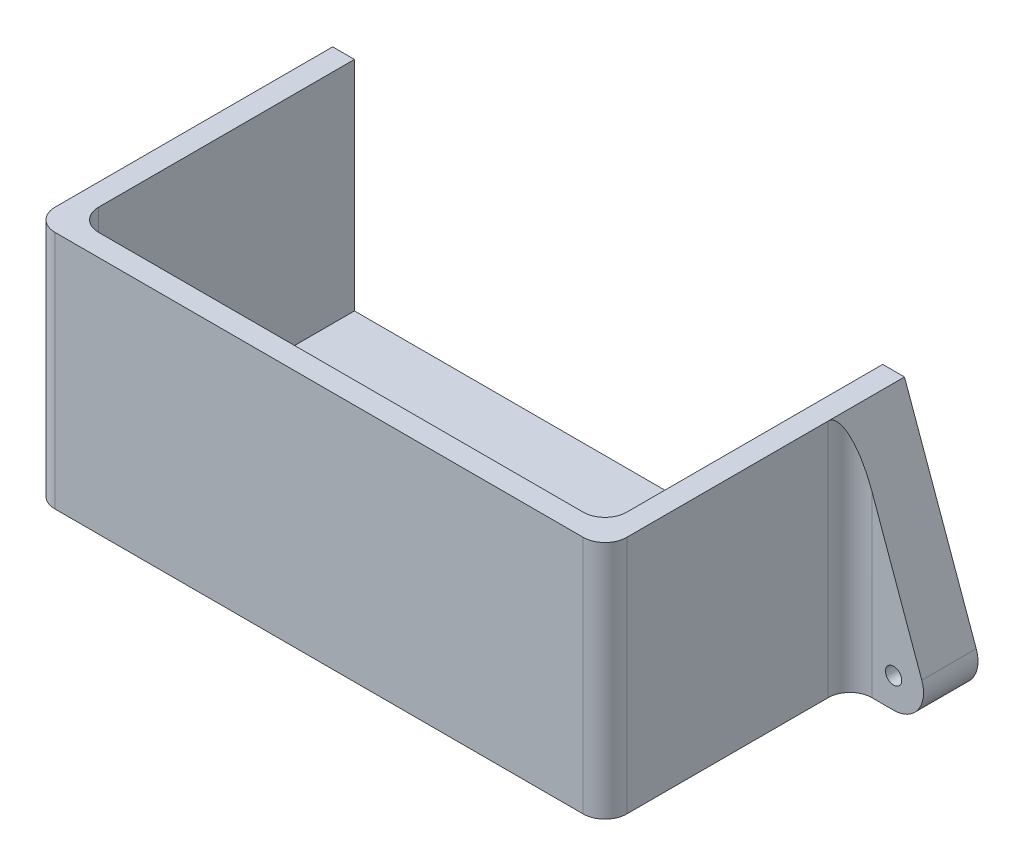
ISO-10303-21;
HEADER;
FILE_DESCRIPTION(('STEP AP214'),'2;1');
FILE_NAME('part.step','',(''),(''),'','','');
FILE_SCHEMA(('AUTOMOTIVE_DESIGN { 1 0 10303 214 1 1 1 1 }'));
ENDSEC;
DATA;
#1=APPLICATION_CONTEXT('core data for automotive mechanical design processes');
#2=APPLICATION_PROTOCOL_DEFINITION('international standard','automotive_design',2000,#1);
#3=PRODUCT_CONTEXT('',#1,'mechanical');
#4=PRODUCT('Part','Part','',(#3));
#5=PRODUCT_RELATED_PRODUCT_CATEGORY('part','',(#4));
#6=PRODUCT_DEFINITION_FORMATION('','',#4);
#7=PRODUCT_DEFINITION_CONTEXT('part definition',#1,'design');
#8=PRODUCT_DEFINITION('design','',#6,#7);
#9=PRODUCT_DEFINITION_SHAPE('','',#8);
#10=(LENGTH_UNIT() NAMED_UNIT(*) SI_UNIT(.MILLI.,.METRE.));
#11=(NAMED_UNIT(*) PLANE_ANGLE_UNIT() SI_UNIT($,.RADIAN.));
#12=(NAMED_UNIT(*) SI_UNIT($,.STERADIAN.) SOLID_ANGLE_UNIT());
#13=UNCERTAINTY_MEASURE_WITH_UNIT(LENGTH_MEASURE(1.E-05),#10,'distance_accuracy_value','');
#14=(GEOMETRIC_REPRESENTATION_CONTEXT(3) GLOBAL_UNCERTAINTY_ASSIGNED_CONTEXT((#13)) GLOBAL_UNIT_ASSIGNED_CONTEXT((#10,
#11,#12)) REPRESENTATION_CONTEXT('',''));
#15=CARTESIAN_POINT('',(0.,0.,0.));
#16=DIRECTION('',(0.,0.,1.));
#17=DIRECTION('',(1.,0.,0.));
#18=AXIS2_PLACEMENT_3D('',#15,#16,#17);
#19=CARTESIAN_POINT('',(-26.25,2.,-12.75));
#20=DIRECTION('',(1.,0.,0.));
#21=DIRECTION('',(0.,0.,-1.));
#22=AXIS2_PLACEMENT_3D('',#19,#20,#21);
#23=PLANE('',#22);
#24=DIRECTION('',(0.,0.,1.));
#25=VECTOR('',#24,1.);
#26=CARTESIAN_POINT('',(-26.25,22.,-12.75));
#27=LINE('',#26,#25);
#28=CARTESIAN_POINT('',(-26.25,22.,-5.75));
#29=VERTEX_POINT('',#28);
#30=CARTESIAN_POINT('',(-26.25,22.,12.75));
#31=VERTEX_POINT('',#30);
#32=EDGE_CURVE('E234',#29,#31,#27,.T.);
#33=ORIENTED_EDGE('',*,*,#32,.F.);
#34=DIRECTION('',(0.,1.,0.));
#35=VECTOR('',#34,1.);
#36=CARTESIAN_POINT('',(-26.25,0.,-5.75));
#37=LINE('',#36,#35);
#38=CARTESIAN_POINT('',(-26.25,0.,-5.75));
#39=VERTEX_POINT('',#38);
#40=EDGE_CURVE('E318',#29,#39,#37,.F.);
#41=ORIENTED_EDGE('',*,*,#40,.T.);
#42=DIRECTION('',(0.,0.,1.));
#43=VECTOR('',#42,1.);
#44=CARTESIAN_POINT('',(-26.25,0.,-12.75));
#45=LINE('',#44,#43);
#46=CARTESIAN_POINT('',(-26.25,0.,12.75));
#47=VERTEX_POINT('',#46);
#48=EDGE_CURVE('E272',#39,#47,#45,.T.);
#49=ORIENTED_EDGE('',*,*,#48,.T.);
#50=DIRECTION('',(0.,-1.,0.));
#51=VECTOR('',#50,1.);
#52=CARTESIAN_POINT('',(-26.25,2.,12.75));
#53=LINE('',#52,#51);
#54=EDGE_CURVE('E309',#47,#31,#53,.F.);
#55=ORIENTED_EDGE('',*,*,#54,.T.);
#56=EDGE_LOOP('',(#33,#41,#49,#55));
#57=FACE_BOUND('',#56,.T.);
#58=ADVANCED_FACE('F38',(#57),#23,.F.);
#59=CARTESIAN_POINT('',(26.25,2.,-12.75));
#60=DIRECTION('',(-1.,0.,0.));
#61=DIRECTION('',(0.,0.,1.));
#62=AXIS2_PLACEMENT_3D('',#59,#60,#61);
#63=PLANE('',#62);
#64=DIRECTION('',(0.,0.,-1.));
#65=VECTOR('',#64,1.);
#66=CARTESIAN_POINT('',(26.25,0.,-12.75));
#67=LINE('',#66,#65);
#68=CARTESIAN_POINT('',(26.25,0.,12.75));
#69=VERTEX_POINT('',#68);
#70=CARTESIAN_POINT('',(26.25,0.,-5.75));
#71=VERTEX_POINT('',#70);
#72=EDGE_CURVE('E270',#69,#71,#67,.T.);
#73=ORIENTED_EDGE('',*,*,#72,.T.);
#74=DIRECTION('',(0.,1.,0.));
#75=VECTOR('',#74,1.);
#76=CARTESIAN_POINT('',(26.25,22.,-5.75));
#77=LINE('',#76,#75);
#78=CARTESIAN_POINT('',(26.25,22.,-5.75));
#79=VERTEX_POINT('',#78);
#80=EDGE_CURVE('E320',#71,#79,#77,.T.);
#81=ORIENTED_EDGE('',*,*,#80,.T.);
#82=DIRECTION('',(0.,0.,-1.));
#83=VECTOR('',#82,1.);
#84=CARTESIAN_POINT('',(26.25,22.,14.75));
#85=LINE('',#84,#83);
#86=CARTESIAN_POINT('',(26.25,22.,12.75));
#87=VERTEX_POINT('',#86);
#88=EDGE_CURVE('E240',#87,#79,#85,.T.);
#89=ORIENTED_EDGE('',*,*,#88,.F.);
#90=DIRECTION('',(0.,-1.,0.));
#91=VECTOR('',#90,1.);
#92=CARTESIAN_POINT('',(26.25,2.,12.75));
#93=LINE('',#92,#91);
#94=EDGE_CURVE('E292',#87,#69,#93,.T.);
#95=ORIENTED_EDGE('',*,*,#94,.T.);
#96=EDGE_LOOP('',(#73,#81,#89,#95));
#97=FACE_BOUND('',#96,.T.);
#98=ADVANCED_FACE('F343',(#97),#63,.F.);
#99=CARTESIAN_POINT('',(0.,2.,0.));
#100=DIRECTION('',(0.,-1.,0.));
#101=DIRECTION('',(0.,0.,-1.));
#102=AXIS2_PLACEMENT_3D('',#99,#100,#101);
#103=PLANE('',#102);
#104=DIRECTION('',(-1.,0.,0.));
#105=VECTOR('',#104,1.);
#106=CARTESIAN_POINT('',(-24.25,2.,12.75));
#107=LINE('',#106,#105);
#108=CARTESIAN_POINT('',(22.25,2.,12.75));
#109=VERTEX_POINT('',#108);
#110=CARTESIAN_POINT('',(-22.25,2.,12.75));
#111=VERTEX_POINT('',#110);
#112=EDGE_CURVE('E256',#109,#111,#107,.T.);
#113=ORIENTED_EDGE('',*,*,#112,.F.);
#114=CARTESIAN_POINT('',(22.25,2.,10.75));
#115=DIRECTION('',(0.,-1.,0.));
#116=DIRECTION('',(0.,0.,-1.));
#117=AXIS2_PLACEMENT_3D('',#114,#115,#116);
#118=CIRCLE('',#117,2.);
#119=CARTESIAN_POINT('',(24.25,2.,10.75));
#120=VERTEX_POINT('',#119);
#121=EDGE_CURVE('E285',#109,#120,#118,.F.);
#122=ORIENTED_EDGE('',*,*,#121,.T.);
#123=DIRECTION('',(0.,0.,1.));
#124=VECTOR('',#123,1.);
#125=CARTESIAN_POINT('',(24.25,2.,12.75));
#126=LINE('',#125,#124);
#127=CARTESIAN_POINT('',(24.25,2.,-12.75));
#128=VERTEX_POINT('',#127);
#129=EDGE_CURVE('E227',#128,#120,#126,.T.);
#130=ORIENTED_EDGE('',*,*,#129,.F.);
#131=DIRECTION('',(-1.,0.,0.));
#132=VECTOR('',#131,1.);
#133=CARTESIAN_POINT('',(-26.25,2.,-12.75));
#134=LINE('',#133,#132);
#135=CARTESIAN_POINT('',(-24.25,2.,-12.75));
#136=VERTEX_POINT('',#135);
#137=EDGE_CURVE('E266',#128,#136,#134,.T.);
#138=ORIENTED_EDGE('',*,*,#137,.T.);
#139=DIRECTION('',(0.,0.,-1.));
#140=VECTOR('',#139,1.);
#141=CARTESIAN_POINT('',(-24.25,2.,-12.75));
#142=LINE('',#141,#140);
#143=CARTESIAN_POINT('',(-24.25,2.,10.75));
#144=VERTEX_POINT('',#143);
#145=EDGE_CURVE('E235',#144,#136,#142,.T.);
#146=ORIENTED_EDGE('',*,*,#145,.F.);
#147=CARTESIAN_POINT('',(-22.25,2.,10.75));
#148=DIRECTION('',(0.,-1.,0.));
#149=DIRECTION('',(0.,0.,-1.));
#150=AXIS2_PLACEMENT_3D('',#147,#148,#149);
#151=CIRCLE('',#150,2.);
#152=EDGE_CURVE('E283',#144,#111,#151,.F.);
#153=ORIENTED_EDGE('',*,*,#152,.T.);
#154=EDGE_LOOP('',(#113,#122,#130,#138,#146,#153));
#155=FACE_BOUND('',#154,.T.);
#156=ADVANCED_FACE('F390',(#155),#103,.F.);
#157=CARTESIAN_POINT('',(-26.25,2.,-12.75));
#158=DIRECTION('',(0.,0.,1.));
#159=DIRECTION('',(1.,0.,0.));
#160=AXIS2_PLACEMENT_3D('',#157,#158,#159);
#161=PLANE('',#160);
#162=DIRECTION('',(-1.,0.,0.));
#163=VECTOR('',#162,1.);
#164=CARTESIAN_POINT('',(-26.25,0.,-12.75));
#165=LINE('',#164,#163);
#166=CARTESIAN_POINT('',(30.25,0.,-12.75));
#167=VERTEX_POINT('',#166);
#168=CARTESIAN_POINT('',(-30.25,0.,-12.75));
#169=VERTEX_POINT('',#168);
#170=EDGE_CURVE('E265',#167,#169,#165,.T.);
#171=ORIENTED_EDGE('',*,*,#170,.T.);
#172=CARTESIAN_POINT('',(-30.25,2.75,-12.75));
#173=DIRECTION('',(0.,0.,1.));
#174=DIRECTION('',(1.,0.,0.));
#175=AXIS2_PLACEMENT_3D('',#172,#173,#174);
#176=CIRCLE('',#175,2.75);
#177=CARTESIAN_POINT('',(-32.8377655969022,3.68057466948617,-12.75));
#178=VERTEX_POINT('',#177);
#179=EDGE_CURVE('E183',#178,#169,#176,.T.);
#180=ORIENTED_EDGE('',*,*,#179,.F.);
#181=DIRECTION('',(-0.338390788904064,-0.941005671600807,0.));
#182=VECTOR('',#181,1.);
#183=CARTESIAN_POINT('',(-26.25,22.,-12.75));
#184=LINE('',#183,#182);
#185=CARTESIAN_POINT('',(-26.25,22.,-12.75));
#186=VERTEX_POINT('',#185);
#187=EDGE_CURVE('E192',#186,#178,#184,.T.);
#188=ORIENTED_EDGE('',*,*,#187,.F.);
#189=DIRECTION('',(-1.,0.,0.));
#190=VECTOR('',#189,1.);
#191=CARTESIAN_POINT('',(-24.25,22.,-12.75));
#192=LINE('',#191,#190);
#193=CARTESIAN_POINT('',(-24.25,22.,-12.75));
#194=VERTEX_POINT('',#193);
#195=EDGE_CURVE('E232',#194,#186,#192,.T.);
#196=ORIENTED_EDGE('',*,*,#195,.F.);
#197=DIRECTION('',(0.,-1.,0.));
#198=VECTOR('',#197,1.);
#199=CARTESIAN_POINT('',(-24.25,22.,-12.75));
#200=LINE('',#199,#198);
#201=EDGE_CURVE('E253',#194,#136,#200,.T.);
#202=ORIENTED_EDGE('',*,*,#201,.T.);
#203=ORIENTED_EDGE('',*,*,#137,.F.);
#204=DIRECTION('',(0.,-1.,0.));
#205=VECTOR('',#204,1.);
#206=CARTESIAN_POINT('',(24.25,22.,-12.75));
#207=LINE('',#206,#205);
#208=CARTESIAN_POINT('',(24.25,22.,-12.75));
#209=VERTEX_POINT('',#208);
#210=EDGE_CURVE('E262',#209,#128,#207,.T.);
#211=ORIENTED_EDGE('',*,*,#210,.F.);
#212=DIRECTION('',(-1.,0.,0.));
#213=VECTOR('',#212,1.);
#214=CARTESIAN_POINT('',(26.25,22.,-12.75));
#215=LINE('',#214,#213);
#216=CARTESIAN_POINT('',(26.25,22.,-12.75));
#217=VERTEX_POINT('',#216);
#218=EDGE_CURVE('E243',#217,#209,#215,.T.);
#219=ORIENTED_EDGE('',*,*,#218,.F.);
#220=DIRECTION('',(0.338390788904064,-0.941005671600807,0.));
#221=VECTOR('',#220,1.);
#222=CARTESIAN_POINT('',(26.25,22.,-12.75));
#223=LINE('',#222,#221);
#224=CARTESIAN_POINT('',(32.8377655969022,3.68057466948617,-12.75));
#225=VERTEX_POINT('',#224);
#226=EDGE_CURVE('E207',#217,#225,#223,.T.);
#227=ORIENTED_EDGE('',*,*,#226,.T.);
#228=CARTESIAN_POINT('',(30.25,2.75,-12.75));
#229=DIRECTION('',(0.,0.,-1.));
#230=DIRECTION('',(-1.,0.,0.));
#231=AXIS2_PLACEMENT_3D('',#228,#229,#230);
#232=CIRCLE('',#231,2.75);
#233=EDGE_CURVE('E213',#225,#167,#232,.T.);
#234=ORIENTED_EDGE('',*,*,#233,.T.);
#235=EDGE_LOOP('',(#171,#180,#188,#196,#202,#203,#211,#219,#227,#234));
#236=FACE_BOUND('',#235,.T.);
#237=CARTESIAN_POINT('',(30.25,2.75,-12.75));
#238=DIRECTION('',(0.,0.,-1.));
#239=DIRECTION('',(-1.,0.,0.));
#240=AXIS2_PLACEMENT_3D('',#237,#238,#239);
#241=CIRCLE('',#240,0.749999999999998);
#242=CARTESIAN_POINT('',(29.5,2.75,-12.75));
#243=VERTEX_POINT('',#242);
#244=EDGE_CURVE('E202',#243,#243,#241,.T.);
#245=ORIENTED_EDGE('',*,*,#244,.F.);
#246=EDGE_LOOP('',(#245));
#247=FACE_BOUND('',#246,.T.);
#248=CARTESIAN_POINT('',(-30.25,2.75,-12.75));
#249=DIRECTION('',(0.,0.,1.));
#250=DIRECTION('',(1.,0.,0.));
#251=AXIS2_PLACEMENT_3D('',#248,#249,#250);
#252=CIRCLE('',#251,0.749999999999998);
#253=CARTESIAN_POINT('',(-29.5,2.75,-12.75));
#254=VERTEX_POINT('',#253);
#255=EDGE_CURVE('E196',#254,#254,#252,.T.);
#256=ORIENTED_EDGE('',*,*,#255,.T.);
#257=EDGE_LOOP('',(#256));
#258=FACE_BOUND('',#257,.T.);
#259=ADVANCED_FACE('F366',(#236,#247,#258),#161,.F.);
#260=CARTESIAN_POINT('',(-26.25,2.,14.75));
#261=DIRECTION('',(0.,0.,-1.));
#262=DIRECTION('',(-1.,0.,0.));
#263=AXIS2_PLACEMENT_3D('',#260,#261,#262);
#264=PLANE('',#263);
#265=DIRECTION('',(1.,0.,0.));
#266=VECTOR('',#265,1.);
#267=CARTESIAN_POINT('',(-26.25,0.,14.75));
#268=LINE('',#267,#266);
#269=CARTESIAN_POINT('',(-24.25,0.,14.75));
#270=VERTEX_POINT('',#269);
#271=CARTESIAN_POINT('',(24.25,0.,14.75));
#272=VERTEX_POINT('',#271);
#273=EDGE_CURVE('E274',#270,#272,#268,.T.);
#274=ORIENTED_EDGE('',*,*,#273,.T.);
#275=DIRECTION('',(0.,-1.,0.));
#276=VECTOR('',#275,1.);
#277=CARTESIAN_POINT('',(24.25,2.,14.75));
#278=LINE('',#277,#276);
#279=CARTESIAN_POINT('',(24.25,22.,14.75));
#280=VERTEX_POINT('',#279);
#281=EDGE_CURVE('E303',#272,#280,#278,.F.);
#282=ORIENTED_EDGE('',*,*,#281,.T.);
#283=DIRECTION('',(1.,0.,0.));
#284=VECTOR('',#283,1.);
#285=CARTESIAN_POINT('',(-26.25,22.,14.75));
#286=LINE('',#285,#284);
#287=CARTESIAN_POINT('',(-24.25,22.,14.75));
#288=VERTEX_POINT('',#287);
#289=EDGE_CURVE('E237',#288,#280,#286,.T.);
#290=ORIENTED_EDGE('',*,*,#289,.F.);
#291=DIRECTION('',(0.,-1.,0.));
#292=VECTOR('',#291,1.);
#293=CARTESIAN_POINT('',(-24.25,2.,14.75));
#294=LINE('',#293,#292);
#295=EDGE_CURVE('E300',#288,#270,#294,.T.);
#296=ORIENTED_EDGE('',*,*,#295,.T.);
#297=EDGE_LOOP('',(#274,#282,#290,#296));
#298=FACE_BOUND('',#297,.T.);
#299=ADVANCED_FACE('F352',(#298),#264,.F.);
#300=CARTESIAN_POINT('',(0.,0.,0.));
#301=DIRECTION('',(0.,-1.,0.));
#302=DIRECTION('',(0.,0.,-1.));
#303=AXIS2_PLACEMENT_3D('',#300,#301,#302);
#304=PLANE('',#303);
#305=ORIENTED_EDGE('',*,*,#72,.F.);
#306=CARTESIAN_POINT('',(24.25,0.,12.75));
#307=DIRECTION('',(0.,-1.,0.));
#308=DIRECTION('',(0.,0.,-1.));
#309=AXIS2_PLACEMENT_3D('',#306,#307,#308);
#310=CIRCLE('',#309,2.);
#311=EDGE_CURVE('E298',#69,#272,#310,.T.);
#312=ORIENTED_EDGE('',*,*,#311,.T.);
#313=ORIENTED_EDGE('',*,*,#273,.F.);
#314=CARTESIAN_POINT('',(-24.25,0.,12.75));
#315=DIRECTION('',(0.,-1.,0.));
#316=DIRECTION('',(0.,0.,-1.));
#317=AXIS2_PLACEMENT_3D('',#314,#315,#316);
#318=CIRCLE('',#317,2.);
#319=EDGE_CURVE('E295',#270,#47,#318,.T.);
#320=ORIENTED_EDGE('',*,*,#319,.T.);
#321=ORIENTED_EDGE('',*,*,#48,.F.);
#322=CARTESIAN_POINT('',(-28.25,0.,-5.75));
#323=DIRECTION('',(0.,-1.,0.));
#324=DIRECTION('',(0.,0.,-1.));
#325=AXIS2_PLACEMENT_3D('',#322,#323,#324);
#326=CIRCLE('',#325,2.);
#327=CARTESIAN_POINT('',(-28.25,0.,-7.75));
#328=VERTEX_POINT('',#327);
#329=EDGE_CURVE('E191',#39,#328,#326,.F.);
#330=ORIENTED_EDGE('',*,*,#329,.T.);
#331=DIRECTION('',(1.,0.,0.));
#332=VECTOR('',#331,1.);
#333=CARTESIAN_POINT('',(-26.25,0.,-7.75));
#334=LINE('',#333,#332);
#335=CARTESIAN_POINT('',(-30.25,0.,-7.75));
#336=VERTEX_POINT('',#335);
#337=EDGE_CURVE('E170',#336,#328,#334,.T.);
#338=ORIENTED_EDGE('',*,*,#337,.F.);
#339=DIRECTION('',(0.,0.,-1.));
#340=VECTOR('',#339,1.);
#341=CARTESIAN_POINT('',(-30.25,0.,-7.75));
#342=LINE('',#341,#340);
#343=EDGE_CURVE('E180',#336,#169,#342,.T.);
#344=ORIENTED_EDGE('',*,*,#343,.T.);
#345=ORIENTED_EDGE('',*,*,#170,.F.);
#346=DIRECTION('',(0.,0.,-1.));
#347=VECTOR('',#346,1.);
#348=CARTESIAN_POINT('',(30.25,0.,-7.75));
#349=LINE('',#348,#347);
#350=CARTESIAN_POINT('',(30.25,0.,-7.75));
#351=VERTEX_POINT('',#350);
#352=EDGE_CURVE('E224',#351,#167,#349,.T.);
#353=ORIENTED_EDGE('',*,*,#352,.F.);
#354=DIRECTION('',(-1.,0.,0.));
#355=VECTOR('',#354,1.);
#356=CARTESIAN_POINT('',(26.25,0.,-7.75));
#357=LINE('',#356,#355);
#358=CARTESIAN_POINT('',(28.25,0.,-7.75));
#359=VERTEX_POINT('',#358);
#360=EDGE_CURVE('E216',#351,#359,#357,.T.);
#361=ORIENTED_EDGE('',*,*,#360,.T.);
#362=CARTESIAN_POINT('',(28.25,0.,-5.75));
#363=DIRECTION('',(0.,-1.,0.));
#364=DIRECTION('',(0.,0.,-1.));
#365=AXIS2_PLACEMENT_3D('',#362,#363,#364);
#366=CIRCLE('',#365,2.);
#367=EDGE_CURVE('E11',#359,#71,#366,.F.);
#368=ORIENTED_EDGE('',*,*,#367,.T.);
#369=EDGE_LOOP('',(#305,#312,#313,#320,#321,#330,#338,#344,#345,#353,#361,#368));
#370=FACE_BOUND('',#369,.T.);
#371=ADVANCED_FACE('F188',(#370),#304,.T.);
#372=CARTESIAN_POINT('',(24.25,22.,12.75));
#373=DIRECTION('',(1.,0.,0.));
#374=DIRECTION('',(0.,0.,-1.));
#375=AXIS2_PLACEMENT_3D('',#372,#373,#374);
#376=PLANE('',#375);
#377=ORIENTED_EDGE('',*,*,#129,.T.);
#378=DIRECTION('',(0.,-1.,0.));
#379=VECTOR('',#378,1.);
#380=CARTESIAN_POINT('',(24.25,22.,10.75));
#381=LINE('',#380,#379);
#382=CARTESIAN_POINT('',(24.25,22.,10.75));
#383=VERTEX_POINT('',#382);
#384=EDGE_CURVE('E287',#120,#383,#381,.F.);
#385=ORIENTED_EDGE('',*,*,#384,.T.);
#386=DIRECTION('',(0.,0.,1.));
#387=VECTOR('',#386,1.);
#388=CARTESIAN_POINT('',(24.25,22.,12.75));
#389=LINE('',#388,#387);
#390=EDGE_CURVE('E245',#209,#383,#389,.T.);
#391=ORIENTED_EDGE('',*,*,#390,.F.);
#392=ORIENTED_EDGE('',*,*,#210,.T.);
#393=EDGE_LOOP('',(#377,#385,#391,#392));
#394=FACE_BOUND('',#393,.T.);
#395=ADVANCED_FACE('F378',(#394),#376,.F.);
#396=CARTESIAN_POINT('',(-24.25,22.,12.75));
#397=DIRECTION('',(0.,0.,1.));
#398=DIRECTION('',(1.,0.,0.));
#399=AXIS2_PLACEMENT_3D('',#396,#397,#398);
#400=PLANE('',#399);
#401=DIRECTION('',(-1.,0.,0.));
#402=VECTOR('',#401,1.);
#403=CARTESIAN_POINT('',(-24.25,22.,12.75));
#404=LINE('',#403,#402);
#405=CARTESIAN_POINT('',(22.25,22.,12.75));
#406=VERTEX_POINT('',#405);
#407=CARTESIAN_POINT('',(-22.25,22.,12.75));
#408=VERTEX_POINT('',#407);
#409=EDGE_CURVE('E248',#406,#408,#404,.T.);
#410=ORIENTED_EDGE('',*,*,#409,.F.);
#411=DIRECTION('',(0.,-1.,0.));
#412=VECTOR('',#411,1.);
#413=CARTESIAN_POINT('',(22.25,2.,12.75));
#414=LINE('',#413,#412);
#415=EDGE_CURVE('E280',#406,#109,#414,.T.);
#416=ORIENTED_EDGE('',*,*,#415,.T.);
#417=ORIENTED_EDGE('',*,*,#112,.T.);
#418=DIRECTION('',(0.,-1.,0.));
#419=VECTOR('',#418,1.);
#420=CARTESIAN_POINT('',(-22.25,22.,12.75));
#421=LINE('',#420,#419);
#422=EDGE_CURVE('E269',#111,#408,#421,.F.);
#423=ORIENTED_EDGE('',*,*,#422,.T.);
#424=EDGE_LOOP('',(#410,#416,#417,#423));
#425=FACE_BOUND('',#424,.T.);
#426=ADVANCED_FACE('F387',(#425),#400,.F.);
#427=CARTESIAN_POINT('',(-24.25,22.,-12.75));
#428=DIRECTION('',(-1.,0.,0.));
#429=DIRECTION('',(0.,0.,1.));
#430=AXIS2_PLACEMENT_3D('',#427,#428,#429);
#431=PLANE('',#430);
#432=DIRECTION('',(0.,0.,-1.));
#433=VECTOR('',#432,1.);
#434=CARTESIAN_POINT('',(-24.25,22.,-12.75));
#435=LINE('',#434,#433);
#436=CARTESIAN_POINT('',(-24.25,22.,10.75));
#437=VERTEX_POINT('',#436);
#438=EDGE_CURVE('E251',#437,#194,#435,.T.);
#439=ORIENTED_EDGE('',*,*,#438,.F.);
#440=DIRECTION('',(0.,-1.,0.));
#441=VECTOR('',#440,1.);
#442=CARTESIAN_POINT('',(-24.25,2.,10.75));
#443=LINE('',#442,#441);
#444=EDGE_CURVE('E289',#437,#144,#443,.T.);
#445=ORIENTED_EDGE('',*,*,#444,.T.);
#446=ORIENTED_EDGE('',*,*,#145,.T.);
#447=ORIENTED_EDGE('',*,*,#201,.F.);
#448=EDGE_LOOP('',(#439,#445,#446,#447));
#449=FACE_BOUND('',#448,.T.);
#450=ADVANCED_FACE('F398',(#449),#431,.F.);
#451=CARTESIAN_POINT('',(0.,22.,0.));
#452=DIRECTION('',(0.,1.,0.));
#453=DIRECTION('',(0.,0.,1.));
#454=AXIS2_PLACEMENT_3D('',#451,#452,#453);
#455=PLANE('',#454);
#456=ORIENTED_EDGE('',*,*,#289,.T.);
#457=CARTESIAN_POINT('',(24.25,22.,12.75));
#458=DIRECTION('',(0.,1.,0.));
#459=DIRECTION('',(0.,0.,1.));
#460=AXIS2_PLACEMENT_3D('',#457,#458,#459);
#461=CIRCLE('',#460,2.);
#462=EDGE_CURVE('E307',#280,#87,#461,.T.);
#463=ORIENTED_EDGE('',*,*,#462,.T.);
#464=ORIENTED_EDGE('',*,*,#88,.T.);
#465=DIRECTION('',(0.,0.,-1.));
#466=VECTOR('',#465,1.);
#467=CARTESIAN_POINT('',(26.25,22.,-7.75));
#468=LINE('',#467,#466);
#469=EDGE_CURVE('E219',#79,#217,#468,.T.);
#470=ORIENTED_EDGE('',*,*,#469,.T.);
#471=ORIENTED_EDGE('',*,*,#218,.T.);
#472=ORIENTED_EDGE('',*,*,#390,.T.);
#473=CARTESIAN_POINT('',(22.25,22.,10.75));
#474=DIRECTION('',(0.,1.,0.));
#475=DIRECTION('',(0.,0.,1.));
#476=AXIS2_PLACEMENT_3D('',#473,#474,#475);
#477=CIRCLE('',#476,2.);
#478=EDGE_CURVE('E312',#383,#406,#477,.F.);
#479=ORIENTED_EDGE('',*,*,#478,.T.);
#480=ORIENTED_EDGE('',*,*,#409,.T.);
#481=CARTESIAN_POINT('',(-22.25,22.,10.75));
#482=DIRECTION('',(0.,1.,0.));
#483=DIRECTION('',(0.,0.,1.));
#484=AXIS2_PLACEMENT_3D('',#481,#482,#483);
#485=CIRCLE('',#484,2.);
#486=EDGE_CURVE('E314',#408,#437,#485,.F.);
#487=ORIENTED_EDGE('',*,*,#486,.T.);
#488=ORIENTED_EDGE('',*,*,#438,.T.);
#489=ORIENTED_EDGE('',*,*,#195,.T.);
#490=EDGE_CURVE('E54',#186,#29,#27,.T.);
#491=ORIENTED_EDGE('',*,*,#490,.T.);
#492=ORIENTED_EDGE('',*,*,#32,.T.);
#493=CARTESIAN_POINT('',(-24.25,22.,12.75));
#494=DIRECTION('',(0.,1.,0.));
#495=DIRECTION('',(0.,0.,1.));
#496=AXIS2_PLACEMENT_3D('',#493,#494,#495);
#497=CIRCLE('',#496,2.);
#498=EDGE_CURVE('E305',#31,#288,#497,.T.);
#499=ORIENTED_EDGE('',*,*,#498,.T.);
#500=EDGE_LOOP('',(#456,#463,#464,#470,#471,#472,#479,#480,#487,#488,#489,#491,#492,#499));
#501=FACE_BOUND('',#500,.T.);
#502=ADVANCED_FACE('F373',(#501),#455,.T.);
#503=CARTESIAN_POINT('',(22.25,22.,10.75));
#504=DIRECTION('',(0.,1.,0.));
#505=DIRECTION('',(0.,0.,1.));
#506=AXIS2_PLACEMENT_3D('',#503,#504,#505);
#507=CYLINDRICAL_SURFACE('',#506,2.);
#508=ORIENTED_EDGE('',*,*,#478,.F.);
#509=ORIENTED_EDGE('',*,*,#384,.F.);
#510=ORIENTED_EDGE('',*,*,#121,.F.);
#511=ORIENTED_EDGE('',*,*,#415,.F.);
#512=EDGE_LOOP('',(#508,#509,#510,#511));
#513=FACE_BOUND('',#512,.T.);
#514=ADVANCED_FACE('F384',(#513),#507,.F.);
#515=CARTESIAN_POINT('',(-22.25,22.,10.75));
#516=DIRECTION('',(0.,1.,0.));
#517=DIRECTION('',(0.,0.,1.));
#518=AXIS2_PLACEMENT_3D('',#515,#516,#517);
#519=CYLINDRICAL_SURFACE('',#518,2.);
#520=ORIENTED_EDGE('',*,*,#486,.F.);
#521=ORIENTED_EDGE('',*,*,#422,.F.);
#522=ORIENTED_EDGE('',*,*,#152,.F.);
#523=ORIENTED_EDGE('',*,*,#444,.F.);
#524=EDGE_LOOP('',(#520,#521,#522,#523));
#525=FACE_BOUND('',#524,.T.);
#526=ADVANCED_FACE('F395',(#525),#519,.F.);
#527=CARTESIAN_POINT('',(24.25,2.,12.75));
#528=DIRECTION('',(0.,-1.,0.));
#529=DIRECTION('',(0.,0.,-1.));
#530=AXIS2_PLACEMENT_3D('',#527,#528,#529);
#531=CYLINDRICAL_SURFACE('',#530,2.);
#532=ORIENTED_EDGE('',*,*,#462,.F.);
#533=ORIENTED_EDGE('',*,*,#281,.F.);
#534=ORIENTED_EDGE('',*,*,#311,.F.);
#535=ORIENTED_EDGE('',*,*,#94,.F.);
#536=EDGE_LOOP('',(#532,#533,#534,#535));
#537=FACE_BOUND('',#536,.T.);
#538=ADVANCED_FACE('F348',(#537),#531,.T.);
#539=CARTESIAN_POINT('',(-24.25,2.,12.75));
#540=DIRECTION('',(0.,-1.,0.));
#541=DIRECTION('',(0.,0.,-1.));
#542=AXIS2_PLACEMENT_3D('',#539,#540,#541);
#543=CYLINDRICAL_SURFACE('',#542,2.);
#544=ORIENTED_EDGE('',*,*,#498,.F.);
#545=ORIENTED_EDGE('',*,*,#54,.F.);
#546=ORIENTED_EDGE('',*,*,#319,.F.);
#547=ORIENTED_EDGE('',*,*,#295,.F.);
#548=EDGE_LOOP('',(#544,#545,#546,#547));
#549=FACE_BOUND('',#548,.T.);
#550=ADVANCED_FACE('F357',(#549),#543,.T.);
#551=CARTESIAN_POINT('',(30.25,2.75,-7.75));
#552=DIRECTION('',(0.,0.,-1.));
#553=DIRECTION('',(-1.,0.,0.));
#554=AXIS2_PLACEMENT_3D('',#551,#552,#553);
#555=CYLINDRICAL_SURFACE('',#554,2.75);
#556=ORIENTED_EDGE('',*,*,#233,.F.);
#557=DIRECTION('',(0.,0.,-1.));
#558=VECTOR('',#557,1.);
#559=CARTESIAN_POINT('',(32.8377655969022,3.68057466948617,-7.75));
#560=LINE('',#559,#558);
#561=CARTESIAN_POINT('',(32.8377655969022,3.68057466948617,-7.75));
#562=VERTEX_POINT('',#561);
#563=EDGE_CURVE('E228',#562,#225,#560,.T.);
#564=ORIENTED_EDGE('',*,*,#563,.F.);
#565=CARTESIAN_POINT('',(30.25,2.75,-7.75));
#566=DIRECTION('',(0.,0.,-1.));
#567=DIRECTION('',(-1.,0.,0.));
#568=AXIS2_PLACEMENT_3D('',#565,#566,#567);
#569=CIRCLE('',#568,2.75);
#570=EDGE_CURVE('E212',#562,#351,#569,.T.);
#571=ORIENTED_EDGE('',*,*,#570,.T.);
#572=ORIENTED_EDGE('',*,*,#352,.T.);
#573=EDGE_LOOP('',(#556,#564,#571,#572));
#574=FACE_BOUND('',#573,.T.);
#575=ADVANCED_FACE('F371',(#574),#555,.T.);
#576=CARTESIAN_POINT('',(26.25,22.,-7.75));
#577=DIRECTION('',(0.941005671600807,0.338390788904064,0.));
#578=DIRECTION('',(-0.338390788904064,0.941005671600807,0.));
#579=AXIS2_PLACEMENT_3D('',#576,#577,#578);
#580=PLANE('',#579);
#581=ORIENTED_EDGE('',*,*,#226,.F.);
#582=ORIENTED_EDGE('',*,*,#469,.F.);
#583=CARTESIAN_POINT('',(28.25,16.4383493732296,-5.75));
#584=DIRECTION('',(0.941005671600807,0.338390788904064,0.));
#585=DIRECTION('',(0.338390788904064,-0.941005671600807,0.));
#586=AXIS2_PLACEMENT_3D('',#583,#584,#585);
#587=ELLIPSE('',#586,5.91032636106124,2.);
#588=CARTESIAN_POINT('',(28.25,16.4383493732296,-7.75));
#589=VERTEX_POINT('',#588);
#590=EDGE_CURVE('E47',#79,#589,#587,.F.);
#591=ORIENTED_EDGE('',*,*,#590,.T.);
#592=DIRECTION('',(0.338390788904064,-0.941005671600807,0.));
#593=VECTOR('',#592,1.);
#594=CARTESIAN_POINT('',(26.25,22.,-7.75));
#595=LINE('',#594,#593);
#596=EDGE_CURVE('E210',#589,#562,#595,.T.);
#597=ORIENTED_EDGE('',*,*,#596,.T.);
#598=ORIENTED_EDGE('',*,*,#563,.T.);
#599=EDGE_LOOP('',(#581,#582,#591,#597,#598));
#600=FACE_BOUND('',#599,.T.);
#601=ADVANCED_FACE('F332',(#600),#580,.T.);
#602=CARTESIAN_POINT('',(30.25,2.75,-7.75));
#603=DIRECTION('',(0.,0.,-1.));
#604=DIRECTION('',(-1.,0.,0.));
#605=AXIS2_PLACEMENT_3D('',#602,#603,#604);
#606=PLANE('',#605);
#607=CARTESIAN_POINT('',(30.25,2.75,-7.75));
#608=DIRECTION('',(0.,0.,-1.));
#609=DIRECTION('',(-1.,0.,0.));
#610=AXIS2_PLACEMENT_3D('',#607,#608,#609);
#611=CIRCLE('',#610,0.749999999999998);
#612=CARTESIAN_POINT('',(29.5,2.75,-7.75));
#613=VERTEX_POINT('',#612);
#614=EDGE_CURVE('E204',#613,#613,#611,.T.);
#615=ORIENTED_EDGE('',*,*,#614,.T.);
#616=EDGE_LOOP('',(#615));
#617=FACE_BOUND('',#616,.T.);
#618=ORIENTED_EDGE('',*,*,#596,.F.);
#619=DIRECTION('',(0.,1.,0.));
#620=VECTOR('',#619,1.);
#621=CARTESIAN_POINT('',(28.25,0.,-7.75));
#622=LINE('',#621,#620);
#623=EDGE_CURVE('E323',#589,#359,#622,.F.);
#624=ORIENTED_EDGE('',*,*,#623,.T.);
#625=ORIENTED_EDGE('',*,*,#360,.F.);
#626=ORIENTED_EDGE('',*,*,#570,.F.);
#627=EDGE_LOOP('',(#618,#624,#625,#626));
#628=FACE_BOUND('',#627,.T.);
#629=ADVANCED_FACE('F339',(#617,#628),#606,.F.);
#630=CARTESIAN_POINT('',(30.25,2.75,-7.75));
#631=DIRECTION('',(0.,0.,-1.));
#632=DIRECTION('',(-1.,0.,0.));
#633=AXIS2_PLACEMENT_3D('',#630,#631,#632);
#634=CYLINDRICAL_SURFACE('',#633,0.749999999999998);
#635=ORIENTED_EDGE('',*,*,#614,.F.);
#636=EDGE_LOOP('',(#635));
#637=FACE_BOUND('',#636,.T.);
#638=ORIENTED_EDGE('',*,*,#244,.T.);
#639=EDGE_LOOP('',(#638));
#640=FACE_BOUND('',#639,.T.);
#641=ADVANCED_FACE('F442',(#637,#640),#634,.F.);
#642=CARTESIAN_POINT('',(-30.25,2.75,-7.75));
#643=DIRECTION('',(0.,0.,-1.));
#644=DIRECTION('',(1.,0.,0.));
#645=AXIS2_PLACEMENT_3D('',#642,#643,#644);
#646=PLANE('',#645);
#647=ORIENTED_EDGE('',*,*,#337,.T.);
#648=DIRECTION('',(0.,1.,0.));
#649=VECTOR('',#648,1.);
#650=CARTESIAN_POINT('',(-28.25,22.,-7.75));
#651=LINE('',#650,#649);
#652=CARTESIAN_POINT('',(-28.25,16.4383493732296,-7.75));
#653=VERTEX_POINT('',#652);
#654=EDGE_CURVE('E316',#328,#653,#651,.T.);
#655=ORIENTED_EDGE('',*,*,#654,.T.);
#656=DIRECTION('',(-0.338390788904064,-0.941005671600807,0.));
#657=VECTOR('',#656,1.);
#658=CARTESIAN_POINT('',(-26.25,22.,-7.75));
#659=LINE('',#658,#657);
#660=CARTESIAN_POINT('',(-32.8377655969022,3.68057466948617,-7.75));
#661=VERTEX_POINT('',#660);
#662=EDGE_CURVE('E173',#653,#661,#659,.T.);
#663=ORIENTED_EDGE('',*,*,#662,.T.);
#664=CARTESIAN_POINT('',(-30.25,2.75,-7.75));
#665=DIRECTION('',(0.,0.,1.));
#666=DIRECTION('',(1.,0.,0.));
#667=AXIS2_PLACEMENT_3D('',#664,#665,#666);
#668=CIRCLE('',#667,2.75);
#669=EDGE_CURVE('E164',#661,#336,#668,.T.);
#670=ORIENTED_EDGE('',*,*,#669,.T.);
#671=EDGE_LOOP('',(#647,#655,#663,#670));
#672=FACE_BOUND('',#671,.T.);
#673=CARTESIAN_POINT('',(-30.25,2.75,-7.75));
#674=DIRECTION('',(0.,0.,1.));
#675=DIRECTION('',(1.,0.,0.));
#676=AXIS2_PLACEMENT_3D('',#673,#674,#675);
#677=CIRCLE('',#676,0.749999999999998);
#678=CARTESIAN_POINT('',(-29.5,2.75,-7.75));
#679=VERTEX_POINT('',#678);
#680=EDGE_CURVE('E200',#679,#679,#677,.T.);
#681=ORIENTED_EDGE('',*,*,#680,.F.);
#682=EDGE_LOOP('',(#681));
#683=FACE_BOUND('',#682,.T.);
#684=ADVANCED_FACE('F166',(#672,#683),#646,.F.);
#685=CARTESIAN_POINT('',(-26.25,22.,-7.75));
#686=DIRECTION('',(0.941005671600807,-0.338390788904064,0.));
#687=DIRECTION('',(0.338390788904064,0.941005671600807,0.));
#688=AXIS2_PLACEMENT_3D('',#685,#686,#687);
#689=PLANE('',#688);
#690=ORIENTED_EDGE('',*,*,#187,.T.);
#691=DIRECTION('',(0.,0.,-1.));
#692=VECTOR('',#691,1.);
#693=CARTESIAN_POINT('',(-32.8377655969022,3.68057466948617,-7.75));
#694=LINE('',#693,#692);
#695=EDGE_CURVE('E185',#661,#178,#694,.T.);
#696=ORIENTED_EDGE('',*,*,#695,.F.);
#697=ORIENTED_EDGE('',*,*,#662,.F.);
#698=CARTESIAN_POINT('',(-28.25,16.4383493732296,-5.75));
#699=DIRECTION('',(0.941005671600807,-0.338390788904064,0.));
#700=DIRECTION('',(-0.338390788904064,-0.941005671600807,0.));
#701=AXIS2_PLACEMENT_3D('',#698,#699,#700);
#702=ELLIPSE('',#701,5.91032636106124,2.);
#703=EDGE_CURVE('E325',#653,#29,#702,.T.);
#704=ORIENTED_EDGE('',*,*,#703,.T.);
#705=ORIENTED_EDGE('',*,*,#490,.F.);
#706=EDGE_LOOP('',(#690,#696,#697,#704,#705));
#707=FACE_BOUND('',#706,.T.);
#708=ADVANCED_FACE('F364',(#707),#689,.F.);
#709=CARTESIAN_POINT('',(-30.25,2.75,-7.75));
#710=DIRECTION('',(0.,0.,-1.));
#711=DIRECTION('',(-1.,0.,0.));
#712=AXIS2_PLACEMENT_3D('',#709,#710,#711);
#713=CYLINDRICAL_SURFACE('',#712,2.75);
#714=ORIENTED_EDGE('',*,*,#179,.T.);
#715=ORIENTED_EDGE('',*,*,#343,.F.);
#716=ORIENTED_EDGE('',*,*,#669,.F.);
#717=ORIENTED_EDGE('',*,*,#695,.T.);
#718=EDGE_LOOP('',(#714,#715,#716,#717));
#719=FACE_BOUND('',#718,.T.);
#720=ADVANCED_FACE('F181',(#719),#713,.T.);
#721=CARTESIAN_POINT('',(-30.25,2.75,-7.75));
#722=DIRECTION('',(0.,0.,-1.));
#723=DIRECTION('',(-1.,0.,0.));
#724=AXIS2_PLACEMENT_3D('',#721,#722,#723);
#725=CYLINDRICAL_SURFACE('',#724,0.749999999999998);
#726=ORIENTED_EDGE('',*,*,#680,.T.);
#727=EDGE_LOOP('',(#726));
#728=FACE_BOUND('',#727,.T.);
#729=ORIENTED_EDGE('',*,*,#255,.F.);
#730=EDGE_LOOP('',(#729));
#731=FACE_BOUND('',#730,.T.);
#732=ADVANCED_FACE('F426',(#728,#731),#725,.F.);
#733=CARTESIAN_POINT('',(-28.25,2.75,-5.75));
#734=DIRECTION('',(0.,-1.,0.));
#735=DIRECTION('',(0.,0.,-1.));
#736=AXIS2_PLACEMENT_3D('',#733,#734,#735);
#737=CYLINDRICAL_SURFACE('',#736,2.);
#738=ORIENTED_EDGE('',*,*,#329,.F.);
#739=ORIENTED_EDGE('',*,*,#40,.F.);
#740=ORIENTED_EDGE('',*,*,#703,.F.);
#741=ORIENTED_EDGE('',*,*,#654,.F.);
#742=EDGE_LOOP('',(#738,#739,#740,#741));
#743=FACE_BOUND('',#742,.T.);
#744=ADVANCED_FACE('F362',(#743),#737,.F.);
#745=CARTESIAN_POINT('',(28.25,2.,-5.75));
#746=DIRECTION('',(0.,-1.,0.));
#747=DIRECTION('',(0.,0.,-1.));
#748=AXIS2_PLACEMENT_3D('',#745,#746,#747);
#749=CYLINDRICAL_SURFACE('',#748,2.);
#750=ORIENTED_EDGE('',*,*,#367,.F.);
#751=ORIENTED_EDGE('',*,*,#623,.F.);
#752=ORIENTED_EDGE('',*,*,#590,.F.);
#753=ORIENTED_EDGE('',*,*,#80,.F.);
#754=EDGE_LOOP('',(#750,#751,#752,#753));
#755=FACE_BOUND('',#754,.T.);
#756=ADVANCED_FACE('F40',(#755),#749,.F.);
#757=CLOSED_SHELL('',(#58,#98,#156,#259,#299,#371,#395,#426,#450,#502,#514,#526,#538,#550,#575,
#601,#629,#641,#684,#708,#720,#732,#744,#756));
#758=MANIFOLD_SOLID_BREP('B2',#757);
#759=ADVANCED_BREP_SHAPE_REPRESENTATION('',(#18,#758),#14);
#760=SHAPE_DEFINITION_REPRESENTATION(#9,#759);
ENDSEC;
END-ISO-10303-21;
